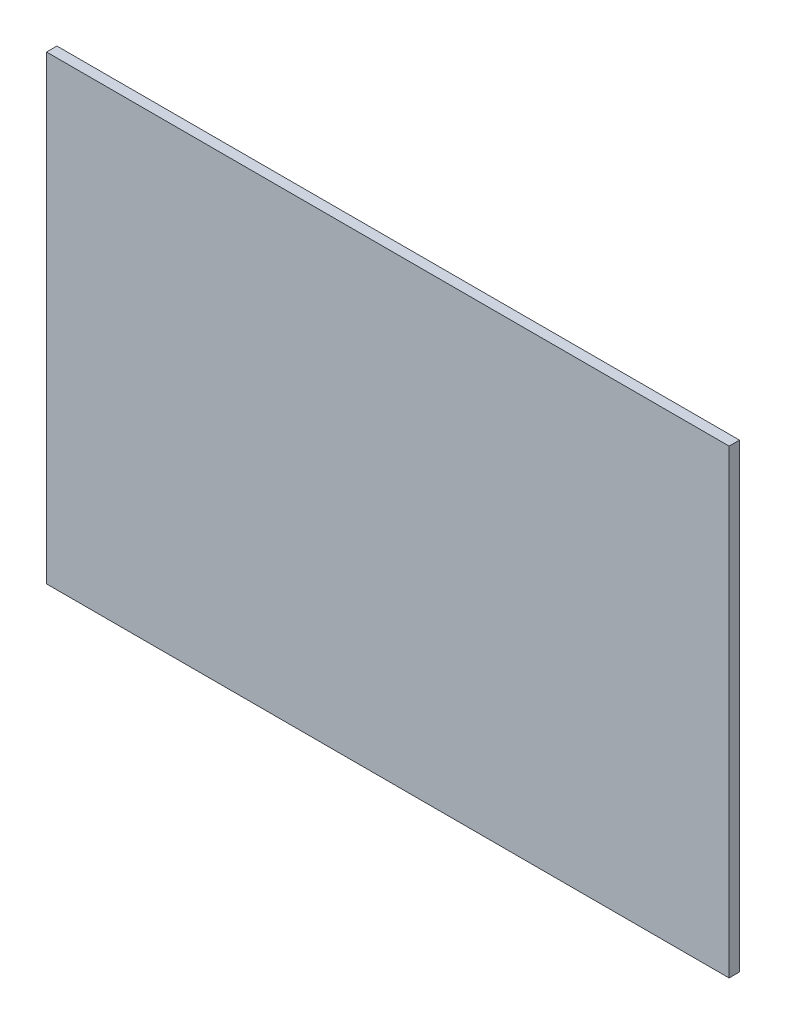
ISO-10303-21;
HEADER;
FILE_DESCRIPTION(('STEP AP214'),'2;1');
FILE_NAME('part.step','',(''),(''),'','','');
FILE_SCHEMA(('AUTOMOTIVE_DESIGN { 1 0 10303 214 1 1 1 1 }'));
ENDSEC;
DATA;
#1=APPLICATION_CONTEXT('core data for automotive mechanical design processes');
#2=APPLICATION_PROTOCOL_DEFINITION('international standard','automotive_design',2000,#1);
#3=PRODUCT_CONTEXT('',#1,'mechanical');
#4=PRODUCT('Part','Part','',(#3));
#5=PRODUCT_RELATED_PRODUCT_CATEGORY('part','',(#4));
#6=PRODUCT_DEFINITION_FORMATION('','',#4);
#7=PRODUCT_DEFINITION_CONTEXT('part definition',#1,'design');
#8=PRODUCT_DEFINITION('design','',#6,#7);
#9=PRODUCT_DEFINITION_SHAPE('','',#8);
#10=(LENGTH_UNIT() NAMED_UNIT(*) SI_UNIT(.MILLI.,.METRE.));
#11=(NAMED_UNIT(*) PLANE_ANGLE_UNIT() SI_UNIT($,.RADIAN.));
#12=(NAMED_UNIT(*) SI_UNIT($,.STERADIAN.) SOLID_ANGLE_UNIT());
#13=UNCERTAINTY_MEASURE_WITH_UNIT(LENGTH_MEASURE(1.E-05),#10,'distance_accuracy_value','');
#14=(GEOMETRIC_REPRESENTATION_CONTEXT(3) GLOBAL_UNCERTAINTY_ASSIGNED_CONTEXT((#13)) GLOBAL_UNIT_ASSIGNED_CONTEXT((#10,
#11,#12)) REPRESENTATION_CONTEXT('',''));
#15=CARTESIAN_POINT('',(0.,0.,0.));
#16=DIRECTION('',(0.,0.,1.));
#17=DIRECTION('',(1.,0.,0.));
#18=AXIS2_PLACEMENT_3D('',#15,#16,#17);
#19=CARTESIAN_POINT('',(52.2224,-35.2425,1.5875));
#20=DIRECTION('',(-1.,0.,0.));
#21=DIRECTION('',(0.,0.,1.));
#22=AXIS2_PLACEMENT_3D('',#19,#20,#21);
#23=PLANE('',#22);
#24=DIRECTION('',(0.,1.,0.));
#25=VECTOR('',#24,1.);
#26=CARTESIAN_POINT('',(52.2224,-35.2425,0.));
#27=LINE('',#26,#25);
#28=CARTESIAN_POINT('',(52.2224,-35.2425,0.));
#29=VERTEX_POINT('',#28);
#30=CARTESIAN_POINT('',(52.2224,35.2425,0.));
#31=VERTEX_POINT('',#30);
#32=EDGE_CURVE('E108',#29,#31,#27,.T.);
#33=ORIENTED_EDGE('',*,*,#32,.T.);
#34=DIRECTION('',(0.,0.,-1.));
#35=VECTOR('',#34,1.);
#36=CARTESIAN_POINT('',(52.2224,35.2425,1.5875));
#37=LINE('',#36,#35);
#38=CARTESIAN_POINT('',(52.2224,35.2425,1.5875));
#39=VERTEX_POINT('',#38);
#40=EDGE_CURVE('E11',#39,#31,#37,.T.);
#41=ORIENTED_EDGE('',*,*,#40,.F.);
#42=DIRECTION('',(0.,1.,0.));
#43=VECTOR('',#42,1.);
#44=CARTESIAN_POINT('',(52.2224,-35.2425,1.5875));
#45=LINE('',#44,#43);
#46=CARTESIAN_POINT('',(52.2224,-35.2425,1.5875));
#47=VERTEX_POINT('',#46);
#48=EDGE_CURVE('E91',#47,#39,#45,.T.);
#49=ORIENTED_EDGE('',*,*,#48,.F.);
#50=DIRECTION('',(0.,0.,-1.));
#51=VECTOR('',#50,1.);
#52=CARTESIAN_POINT('',(52.2224,-35.2425,1.5875));
#53=LINE('',#52,#51);
#54=EDGE_CURVE('E104',#47,#29,#53,.T.);
#55=ORIENTED_EDGE('',*,*,#54,.T.);
#56=EDGE_LOOP('',(#33,#41,#49,#55));
#57=FACE_BOUND('',#56,.T.);
#58=ADVANCED_FACE('F38',(#57),#23,.F.);
#59=CARTESIAN_POINT('',(-52.2224,35.2425,1.5875));
#60=DIRECTION('',(0.,-1.,0.));
#61=DIRECTION('',(0.,0.,-1.));
#62=AXIS2_PLACEMENT_3D('',#59,#60,#61);
#63=PLANE('',#62);
#64=DIRECTION('',(-1.,0.,0.));
#65=VECTOR('',#64,1.);
#66=CARTESIAN_POINT('',(-52.2224,35.2425,0.));
#67=LINE('',#66,#65);
#68=CARTESIAN_POINT('',(-52.2224,35.2425,0.));
#69=VERTEX_POINT('',#68);
#70=EDGE_CURVE('E96',#31,#69,#67,.T.);
#71=ORIENTED_EDGE('',*,*,#70,.T.);
#72=DIRECTION('',(0.,0.,-1.));
#73=VECTOR('',#72,1.);
#74=CARTESIAN_POINT('',(-52.2224,35.2425,1.5875));
#75=LINE('',#74,#73);
#76=CARTESIAN_POINT('',(-52.2224,35.2425,1.5875));
#77=VERTEX_POINT('',#76);
#78=EDGE_CURVE('E46',#77,#69,#75,.T.);
#79=ORIENTED_EDGE('',*,*,#78,.F.);
#80=DIRECTION('',(-1.,0.,0.));
#81=VECTOR('',#80,1.);
#82=CARTESIAN_POINT('',(-52.2224,35.2425,1.5875));
#83=LINE('',#82,#81);
#84=EDGE_CURVE('E85',#39,#77,#83,.T.);
#85=ORIENTED_EDGE('',*,*,#84,.F.);
#86=ORIENTED_EDGE('',*,*,#40,.T.);
#87=EDGE_LOOP('',(#71,#79,#85,#86));
#88=FACE_BOUND('',#87,.T.);
#89=ADVANCED_FACE('F95',(#88),#63,.F.);
#90=CARTESIAN_POINT('',(-52.2224,-35.2425,1.5875));
#91=DIRECTION('',(1.,0.,0.));
#92=DIRECTION('',(0.,0.,-1.));
#93=AXIS2_PLACEMENT_3D('',#90,#91,#92);
#94=PLANE('',#93);
#95=DIRECTION('',(0.,-1.,0.));
#96=VECTOR('',#95,1.);
#97=CARTESIAN_POINT('',(-52.2224,-35.2425,0.));
#98=LINE('',#97,#96);
#99=CARTESIAN_POINT('',(-52.2224,-35.2425,0.));
#100=VERTEX_POINT('',#99);
#101=EDGE_CURVE('E72',#69,#100,#98,.T.);
#102=ORIENTED_EDGE('',*,*,#101,.T.);
#103=DIRECTION('',(0.,0.,-1.));
#104=VECTOR('',#103,1.);
#105=CARTESIAN_POINT('',(-52.2224,-35.2425,1.5875));
#106=LINE('',#105,#104);
#107=CARTESIAN_POINT('',(-52.2224,-35.2425,1.5875));
#108=VERTEX_POINT('',#107);
#109=EDGE_CURVE('E98',#108,#100,#106,.T.);
#110=ORIENTED_EDGE('',*,*,#109,.F.);
#111=DIRECTION('',(0.,-1.,0.));
#112=VECTOR('',#111,1.);
#113=CARTESIAN_POINT('',(-52.2224,-35.2425,1.5875));
#114=LINE('',#113,#112);
#115=EDGE_CURVE('E89',#77,#108,#114,.T.);
#116=ORIENTED_EDGE('',*,*,#115,.F.);
#117=ORIENTED_EDGE('',*,*,#78,.T.);
#118=EDGE_LOOP('',(#102,#110,#116,#117));
#119=FACE_BOUND('',#118,.T.);
#120=ADVANCED_FACE('F99',(#119),#94,.F.);
#121=CARTESIAN_POINT('',(-52.2224,-35.2425,1.5875));
#122=DIRECTION('',(0.,1.,0.));
#123=DIRECTION('',(0.,0.,1.));
#124=AXIS2_PLACEMENT_3D('',#121,#122,#123);
#125=PLANE('',#124);
#126=DIRECTION('',(1.,0.,0.));
#127=VECTOR('',#126,1.);
#128=CARTESIAN_POINT('',(-52.2224,-35.2425,0.));
#129=LINE('',#128,#127);
#130=EDGE_CURVE('E78',#100,#29,#129,.T.);
#131=ORIENTED_EDGE('',*,*,#130,.T.);
#132=ORIENTED_EDGE('',*,*,#54,.F.);
#133=DIRECTION('',(1.,0.,0.));
#134=VECTOR('',#133,1.);
#135=CARTESIAN_POINT('',(-52.2224,-35.2425,1.5875));
#136=LINE('',#135,#134);
#137=EDGE_CURVE('E54',#108,#47,#136,.T.);
#138=ORIENTED_EDGE('',*,*,#137,.F.);
#139=ORIENTED_EDGE('',*,*,#109,.T.);
#140=EDGE_LOOP('',(#131,#132,#138,#139));
#141=FACE_BOUND('',#140,.T.);
#142=ADVANCED_FACE('F116',(#141),#125,.F.);
#143=CARTESIAN_POINT('',(52.2224,35.2425,1.5875));
#144=DIRECTION('',(0.,0.,-1.));
#145=DIRECTION('',(-1.,0.,0.));
#146=AXIS2_PLACEMENT_3D('',#143,#144,#145);
#147=PLANE('',#146);
#148=ORIENTED_EDGE('',*,*,#48,.T.);
#149=ORIENTED_EDGE('',*,*,#84,.T.);
#150=ORIENTED_EDGE('',*,*,#115,.T.);
#151=ORIENTED_EDGE('',*,*,#137,.T.);
#152=EDGE_LOOP('',(#148,#149,#150,#151));
#153=FACE_BOUND('',#152,.T.);
#154=ADVANCED_FACE('F87',(#153),#147,.F.);
#155=CARTESIAN_POINT('',(52.2224,35.2425,0.));
#156=DIRECTION('',(0.,0.,-1.));
#157=DIRECTION('',(-1.,0.,0.));
#158=AXIS2_PLACEMENT_3D('',#155,#156,#157);
#159=PLANE('',#158);
#160=ORIENTED_EDGE('',*,*,#32,.F.);
#161=ORIENTED_EDGE('',*,*,#130,.F.);
#162=ORIENTED_EDGE('',*,*,#101,.F.);
#163=ORIENTED_EDGE('',*,*,#70,.F.);
#164=EDGE_LOOP('',(#160,#161,#162,#163));
#165=FACE_BOUND('',#164,.T.);
#166=ADVANCED_FACE('F119',(#165),#159,.T.);
#167=CLOSED_SHELL('',(#58,#89,#120,#142,#154,#166));
#168=MANIFOLD_SOLID_BREP('B2',#167);
#169=ADVANCED_BREP_SHAPE_REPRESENTATION('',(#18,#168),#14);
#170=SHAPE_DEFINITION_REPRESENTATION(#9,#169);
ENDSEC;
END-ISO-10303-21;
